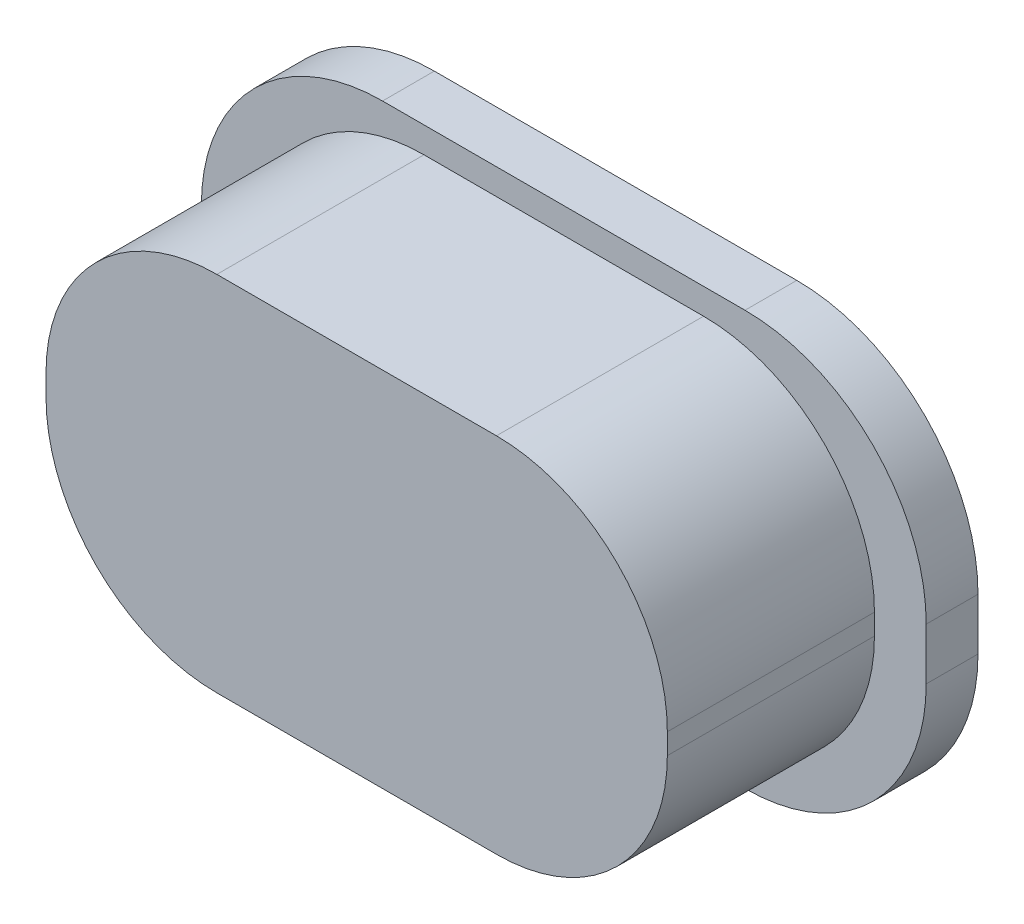
ISO-10303-21;
HEADER;
FILE_DESCRIPTION(('STEP AP214'),'2;1');
FILE_NAME('part.step','',(''),(''),'','','');
FILE_SCHEMA(('AUTOMOTIVE_DESIGN { 1 0 10303 214 1 1 1 1 }'));
ENDSEC;
DATA;
#1=APPLICATION_CONTEXT('core data for automotive mechanical design processes');
#2=APPLICATION_PROTOCOL_DEFINITION('international standard','automotive_design',2000,#1);
#3=PRODUCT_CONTEXT('',#1,'mechanical');
#4=PRODUCT('Part','Part','',(#3));
#5=PRODUCT_RELATED_PRODUCT_CATEGORY('part','',(#4));
#6=PRODUCT_DEFINITION_FORMATION('','',#4);
#7=PRODUCT_DEFINITION_CONTEXT('part definition',#1,'design');
#8=PRODUCT_DEFINITION('design','',#6,#7);
#9=PRODUCT_DEFINITION_SHAPE('','',#8);
#10=(LENGTH_UNIT() NAMED_UNIT(*) SI_UNIT(.MILLI.,.METRE.));
#11=(NAMED_UNIT(*) PLANE_ANGLE_UNIT() SI_UNIT($,.RADIAN.));
#12=(NAMED_UNIT(*) SI_UNIT($,.STERADIAN.) SOLID_ANGLE_UNIT());
#13=UNCERTAINTY_MEASURE_WITH_UNIT(LENGTH_MEASURE(1.E-05),#10,'distance_accuracy_value','');
#14=(GEOMETRIC_REPRESENTATION_CONTEXT(3) GLOBAL_UNCERTAINTY_ASSIGNED_CONTEXT((#13)) GLOBAL_UNIT_ASSIGNED_CONTEXT((#10,
#11,#12)) REPRESENTATION_CONTEXT('',''));
#15=CARTESIAN_POINT('',(0.,0.,0.));
#16=DIRECTION('',(0.,0.,1.));
#17=DIRECTION('',(1.,0.,0.));
#18=AXIS2_PLACEMENT_3D('',#15,#16,#17);
#19=CARTESIAN_POINT('',(0.,0.,1.));
#20=DIRECTION('',(0.,0.,-1.));
#21=DIRECTION('',(-1.,0.,0.));
#22=AXIS2_PLACEMENT_3D('',#19,#20,#21);
#23=PLANE('',#22);
#24=DIRECTION('',(1.,0.,0.));
#25=VECTOR('',#24,1.);
#26=CARTESIAN_POINT('',(-7.,-4.,1.));
#27=LINE('',#26,#25);
#28=CARTESIAN_POINT('',(-3.5,-4.,1.));
#29=VERTEX_POINT('',#28);
#30=CARTESIAN_POINT('',(3.5,-4.,1.));
#31=VERTEX_POINT('',#30);
#32=EDGE_CURVE('E192',#29,#31,#27,.T.);
#33=ORIENTED_EDGE('',*,*,#32,.T.);
#34=CARTESIAN_POINT('',(3.5,-0.500000000000001,1.));
#35=DIRECTION('',(0.,0.,-1.));
#36=DIRECTION('',(-1.,0.,0.));
#37=AXIS2_PLACEMENT_3D('',#34,#35,#36);
#38=CIRCLE('',#37,3.5);
#39=CARTESIAN_POINT('',(7.,-0.500000000000001,1.));
#40=VERTEX_POINT('',#39);
#41=EDGE_CURVE('E255',#31,#40,#38,.F.);
#42=ORIENTED_EDGE('',*,*,#41,.T.);
#43=DIRECTION('',(0.,1.,0.));
#44=VECTOR('',#43,1.);
#45=CARTESIAN_POINT('',(7.,-4.,1.));
#46=LINE('',#45,#44);
#47=CARTESIAN_POINT('',(7.,0.5,1.));
#48=VERTEX_POINT('',#47);
#49=EDGE_CURVE('E184',#40,#48,#46,.T.);
#50=ORIENTED_EDGE('',*,*,#49,.T.);
#51=CARTESIAN_POINT('',(3.5,0.499999999999999,1.));
#52=DIRECTION('',(0.,0.,-1.));
#53=DIRECTION('',(-1.,0.,0.));
#54=AXIS2_PLACEMENT_3D('',#51,#52,#53);
#55=CIRCLE('',#54,3.5);
#56=CARTESIAN_POINT('',(3.5,4.,1.));
#57=VERTEX_POINT('',#56);
#58=EDGE_CURVE('E251',#48,#57,#55,.F.);
#59=ORIENTED_EDGE('',*,*,#58,.T.);
#60=DIRECTION('',(-1.,0.,0.));
#61=VECTOR('',#60,1.);
#62=CARTESIAN_POINT('',(-7.,4.,1.));
#63=LINE('',#62,#61);
#64=CARTESIAN_POINT('',(-3.5,4.,1.));
#65=VERTEX_POINT('',#64);
#66=EDGE_CURVE('E187',#57,#65,#63,.T.);
#67=ORIENTED_EDGE('',*,*,#66,.T.);
#68=CARTESIAN_POINT('',(-3.5,0.5,1.));
#69=DIRECTION('',(0.,0.,-1.));
#70=DIRECTION('',(-1.,0.,0.));
#71=AXIS2_PLACEMENT_3D('',#68,#69,#70);
#72=CIRCLE('',#71,3.5);
#73=CARTESIAN_POINT('',(-7.,0.5,1.));
#74=VERTEX_POINT('',#73);
#75=EDGE_CURVE('E54',#65,#74,#72,.F.);
#76=ORIENTED_EDGE('',*,*,#75,.T.);
#77=DIRECTION('',(0.,-1.,0.));
#78=VECTOR('',#77,1.);
#79=CARTESIAN_POINT('',(-7.,-4.,1.));
#80=LINE('',#79,#78);
#81=CARTESIAN_POINT('',(-7.,-0.500000000000001,1.));
#82=VERTEX_POINT('',#81);
#83=EDGE_CURVE('E190',#74,#82,#80,.T.);
#84=ORIENTED_EDGE('',*,*,#83,.T.);
#85=CARTESIAN_POINT('',(-3.5,-0.500000000000001,1.));
#86=DIRECTION('',(0.,0.,-1.));
#87=DIRECTION('',(-1.,0.,0.));
#88=AXIS2_PLACEMENT_3D('',#85,#86,#87);
#89=CIRCLE('',#88,3.5);
#90=EDGE_CURVE('E253',#82,#29,#89,.F.);
#91=ORIENTED_EDGE('',*,*,#90,.T.);
#92=EDGE_LOOP('',(#33,#42,#50,#59,#67,#76,#84,#91));
#93=FACE_BOUND('',#92,.T.);
#94=DIRECTION('',(0.,1.,0.));
#95=VECTOR('',#94,1.);
#96=CARTESIAN_POINT('',(6.,-3.5,1.));
#97=LINE('',#96,#95);
#98=CARTESIAN_POINT('',(6.,-0.200000000000001,1.));
#99=VERTEX_POINT('',#98);
#100=CARTESIAN_POINT('',(6.,0.2,1.));
#101=VERTEX_POINT('',#100);
#102=EDGE_CURVE('E173',#99,#101,#97,.T.);
#103=ORIENTED_EDGE('',*,*,#102,.F.);
#104=CARTESIAN_POINT('',(2.7,-0.200000000000001,1.));
#105=DIRECTION('',(0.,0.,-1.));
#106=DIRECTION('',(-1.,0.,0.));
#107=AXIS2_PLACEMENT_3D('',#104,#105,#106);
#108=CIRCLE('',#107,3.3);
#109=CARTESIAN_POINT('',(2.7,-3.5,1.));
#110=VERTEX_POINT('',#109);
#111=EDGE_CURVE('E228',#99,#110,#108,.T.);
#112=ORIENTED_EDGE('',*,*,#111,.T.);
#113=DIRECTION('',(1.,0.,0.));
#114=VECTOR('',#113,1.);
#115=CARTESIAN_POINT('',(-6.,-3.5,1.));
#116=LINE('',#115,#114);
#117=CARTESIAN_POINT('',(-2.7,-3.5,1.));
#118=VERTEX_POINT('',#117);
#119=EDGE_CURVE('E176',#118,#110,#116,.T.);
#120=ORIENTED_EDGE('',*,*,#119,.F.);
#121=CARTESIAN_POINT('',(-2.7,-0.200000000000001,1.));
#122=DIRECTION('',(0.,0.,-1.));
#123=DIRECTION('',(-1.,0.,0.));
#124=AXIS2_PLACEMENT_3D('',#121,#122,#123);
#125=CIRCLE('',#124,3.3);
#126=CARTESIAN_POINT('',(-6.,-0.200000000000001,1.));
#127=VERTEX_POINT('',#126);
#128=EDGE_CURVE('E230',#118,#127,#125,.T.);
#129=ORIENTED_EDGE('',*,*,#128,.T.);
#130=DIRECTION('',(0.,-1.,0.));
#131=VECTOR('',#130,1.);
#132=CARTESIAN_POINT('',(-6.,-3.5,1.));
#133=LINE('',#132,#131);
#134=CARTESIAN_POINT('',(-6.,0.2,1.));
#135=VERTEX_POINT('',#134);
#136=EDGE_CURVE('E172',#135,#127,#133,.T.);
#137=ORIENTED_EDGE('',*,*,#136,.F.);
#138=CARTESIAN_POINT('',(-2.7,0.2,1.));
#139=DIRECTION('',(0.,0.,-1.));
#140=DIRECTION('',(-1.,0.,0.));
#141=AXIS2_PLACEMENT_3D('',#138,#139,#140);
#142=CIRCLE('',#141,3.3);
#143=CARTESIAN_POINT('',(-2.7,3.5,1.));
#144=VERTEX_POINT('',#143);
#145=EDGE_CURVE('E157',#135,#144,#142,.T.);
#146=ORIENTED_EDGE('',*,*,#145,.T.);
#147=DIRECTION('',(-1.,0.,0.));
#148=VECTOR('',#147,1.);
#149=CARTESIAN_POINT('',(-6.,3.5,1.));
#150=LINE('',#149,#148);
#151=CARTESIAN_POINT('',(2.7,3.5,1.));
#152=VERTEX_POINT('',#151);
#153=EDGE_CURVE('E164',#152,#144,#150,.T.);
#154=ORIENTED_EDGE('',*,*,#153,.F.);
#155=CARTESIAN_POINT('',(2.7,0.2,1.));
#156=DIRECTION('',(0.,0.,-1.));
#157=DIRECTION('',(-1.,0.,0.));
#158=AXIS2_PLACEMENT_3D('',#155,#156,#157);
#159=CIRCLE('',#158,3.3);
#160=EDGE_CURVE('E147',#152,#101,#159,.T.);
#161=ORIENTED_EDGE('',*,*,#160,.T.);
#162=EDGE_LOOP('',(#103,#112,#120,#129,#137,#146,#154,#161));
#163=FACE_BOUND('',#162,.T.);
#164=ADVANCED_FACE('F32',(#93,#163),#23,.F.);
#165=CARTESIAN_POINT('',(7.,-4.,1.));
#166=DIRECTION('',(-1.,0.,0.));
#167=DIRECTION('',(0.,0.,1.));
#168=AXIS2_PLACEMENT_3D('',#165,#166,#167);
#169=PLANE('',#168);
#170=ORIENTED_EDGE('',*,*,#49,.F.);
#171=DIRECTION('',(0.,0.,-1.));
#172=VECTOR('',#171,1.);
#173=CARTESIAN_POINT('',(7.,-0.500000000000001,1.));
#174=LINE('',#173,#172);
#175=CARTESIAN_POINT('',(7.,-0.500000000000001,0.));
#176=VERTEX_POINT('',#175);
#177=EDGE_CURVE('E234',#40,#176,#174,.T.);
#178=ORIENTED_EDGE('',*,*,#177,.T.);
#179=DIRECTION('',(0.,1.,0.));
#180=VECTOR('',#179,1.);
#181=CARTESIAN_POINT('',(7.,-4.,0.));
#182=LINE('',#181,#180);
#183=CARTESIAN_POINT('',(7.,0.5,0.));
#184=VERTEX_POINT('',#183);
#185=EDGE_CURVE('E195',#176,#184,#182,.T.);
#186=ORIENTED_EDGE('',*,*,#185,.T.);
#187=DIRECTION('',(0.,0.,-1.));
#188=VECTOR('',#187,1.);
#189=CARTESIAN_POINT('',(7.,0.5,1.));
#190=LINE('',#189,#188);
#191=EDGE_CURVE('E232',#184,#48,#190,.F.);
#192=ORIENTED_EDGE('',*,*,#191,.T.);
#193=EDGE_LOOP('',(#170,#178,#186,#192));
#194=FACE_BOUND('',#193,.T.);
#195=ADVANCED_FACE('F289',(#194),#169,.F.);
#196=CARTESIAN_POINT('',(-7.,4.,1.));
#197=DIRECTION('',(0.,-1.,0.));
#198=DIRECTION('',(0.,0.,-1.));
#199=AXIS2_PLACEMENT_3D('',#196,#197,#198);
#200=PLANE('',#199);
#201=ORIENTED_EDGE('',*,*,#66,.F.);
#202=DIRECTION('',(0.,0.,-1.));
#203=VECTOR('',#202,1.);
#204=CARTESIAN_POINT('',(3.5,4.,1.));
#205=LINE('',#204,#203);
#206=CARTESIAN_POINT('',(3.5,4.,0.));
#207=VERTEX_POINT('',#206);
#208=EDGE_CURVE('E11',#57,#207,#205,.T.);
#209=ORIENTED_EDGE('',*,*,#208,.T.);
#210=DIRECTION('',(-1.,0.,0.));
#211=VECTOR('',#210,1.);
#212=CARTESIAN_POINT('',(-7.,4.,0.));
#213=LINE('',#212,#211);
#214=CARTESIAN_POINT('',(-3.5,4.,0.));
#215=VERTEX_POINT('',#214);
#216=EDGE_CURVE('E198',#207,#215,#213,.T.);
#217=ORIENTED_EDGE('',*,*,#216,.T.);
#218=DIRECTION('',(0.,0.,-1.));
#219=VECTOR('',#218,1.);
#220=CARTESIAN_POINT('',(-3.5,4.,1.));
#221=LINE('',#220,#219);
#222=EDGE_CURVE('E40',#215,#65,#221,.F.);
#223=ORIENTED_EDGE('',*,*,#222,.T.);
#224=EDGE_LOOP('',(#201,#209,#217,#223));
#225=FACE_BOUND('',#224,.T.);
#226=ADVANCED_FACE('F263',(#225),#200,.F.);
#227=CARTESIAN_POINT('',(-7.,-4.,1.));
#228=DIRECTION('',(1.,0.,0.));
#229=DIRECTION('',(0.,0.,-1.));
#230=AXIS2_PLACEMENT_3D('',#227,#228,#229);
#231=PLANE('',#230);
#232=DIRECTION('',(0.,-1.,0.));
#233=VECTOR('',#232,1.);
#234=CARTESIAN_POINT('',(-7.,-4.,0.));
#235=LINE('',#234,#233);
#236=CARTESIAN_POINT('',(-7.,0.5,0.));
#237=VERTEX_POINT('',#236);
#238=CARTESIAN_POINT('',(-7.,-0.500000000000001,0.));
#239=VERTEX_POINT('',#238);
#240=EDGE_CURVE('E202',#237,#239,#235,.T.);
#241=ORIENTED_EDGE('',*,*,#240,.T.);
#242=DIRECTION('',(0.,0.,-1.));
#243=VECTOR('',#242,1.);
#244=CARTESIAN_POINT('',(-7.,-0.500000000000001,1.));
#245=LINE('',#244,#243);
#246=EDGE_CURVE('E47',#239,#82,#245,.F.);
#247=ORIENTED_EDGE('',*,*,#246,.T.);
#248=ORIENTED_EDGE('',*,*,#83,.F.);
#249=DIRECTION('',(0.,0.,-1.));
#250=VECTOR('',#249,1.);
#251=CARTESIAN_POINT('',(-7.,0.5,1.));
#252=LINE('',#251,#250);
#253=EDGE_CURVE('E257',#74,#237,#252,.T.);
#254=ORIENTED_EDGE('',*,*,#253,.T.);
#255=EDGE_LOOP('',(#241,#247,#248,#254));
#256=FACE_BOUND('',#255,.T.);
#257=ADVANCED_FACE('F270',(#256),#231,.F.);
#258=CARTESIAN_POINT('',(-7.,-4.,1.));
#259=DIRECTION('',(0.,1.,0.));
#260=DIRECTION('',(0.,0.,1.));
#261=AXIS2_PLACEMENT_3D('',#258,#259,#260);
#262=PLANE('',#261);
#263=DIRECTION('',(1.,0.,0.));
#264=VECTOR('',#263,1.);
#265=CARTESIAN_POINT('',(-7.,-4.,0.));
#266=LINE('',#265,#264);
#267=CARTESIAN_POINT('',(-3.5,-4.,0.));
#268=VERTEX_POINT('',#267);
#269=CARTESIAN_POINT('',(3.5,-4.,0.));
#270=VERTEX_POINT('',#269);
#271=EDGE_CURVE('E188',#268,#270,#266,.T.);
#272=ORIENTED_EDGE('',*,*,#271,.T.);
#273=DIRECTION('',(0.,0.,-1.));
#274=VECTOR('',#273,1.);
#275=CARTESIAN_POINT('',(3.5,-4.,1.));
#276=LINE('',#275,#274);
#277=EDGE_CURVE('E248',#270,#31,#276,.F.);
#278=ORIENTED_EDGE('',*,*,#277,.T.);
#279=ORIENTED_EDGE('',*,*,#32,.F.);
#280=DIRECTION('',(0.,0.,-1.));
#281=VECTOR('',#280,1.);
#282=CARTESIAN_POINT('',(-3.5,-4.,1.));
#283=LINE('',#282,#281);
#284=EDGE_CURVE('E245',#29,#268,#283,.T.);
#285=ORIENTED_EDGE('',*,*,#284,.T.);
#286=EDGE_LOOP('',(#272,#278,#279,#285));
#287=FACE_BOUND('',#286,.T.);
#288=ADVANCED_FACE('F281',(#287),#262,.F.);
#289=CARTESIAN_POINT('',(0.,0.,0.));
#290=DIRECTION('',(0.,0.,-1.));
#291=DIRECTION('',(-1.,0.,0.));
#292=AXIS2_PLACEMENT_3D('',#289,#290,#291);
#293=PLANE('',#292);
#294=ORIENTED_EDGE('',*,*,#185,.F.);
#295=CARTESIAN_POINT('',(3.5,-0.500000000000001,0.));
#296=DIRECTION('',(0.,0.,-1.));
#297=DIRECTION('',(-1.,0.,0.));
#298=AXIS2_PLACEMENT_3D('',#295,#296,#297);
#299=CIRCLE('',#298,3.5);
#300=EDGE_CURVE('E243',#176,#270,#299,.T.);
#301=ORIENTED_EDGE('',*,*,#300,.T.);
#302=ORIENTED_EDGE('',*,*,#271,.F.);
#303=CARTESIAN_POINT('',(-3.5,-0.500000000000001,0.));
#304=DIRECTION('',(0.,0.,-1.));
#305=DIRECTION('',(-1.,0.,0.));
#306=AXIS2_PLACEMENT_3D('',#303,#304,#305);
#307=CIRCLE('',#306,3.5);
#308=EDGE_CURVE('E241',#268,#239,#307,.T.);
#309=ORIENTED_EDGE('',*,*,#308,.T.);
#310=ORIENTED_EDGE('',*,*,#240,.F.);
#311=CARTESIAN_POINT('',(-3.5,0.5,0.));
#312=DIRECTION('',(0.,0.,-1.));
#313=DIRECTION('',(-1.,0.,0.));
#314=AXIS2_PLACEMENT_3D('',#311,#312,#313);
#315=CIRCLE('',#314,3.5);
#316=EDGE_CURVE('E237',#237,#215,#315,.T.);
#317=ORIENTED_EDGE('',*,*,#316,.T.);
#318=ORIENTED_EDGE('',*,*,#216,.F.);
#319=CARTESIAN_POINT('',(3.5,0.499999999999999,0.));
#320=DIRECTION('',(0.,0.,-1.));
#321=DIRECTION('',(-1.,0.,0.));
#322=AXIS2_PLACEMENT_3D('',#319,#320,#321);
#323=CIRCLE('',#322,3.5);
#324=EDGE_CURVE('E239',#207,#184,#323,.T.);
#325=ORIENTED_EDGE('',*,*,#324,.T.);
#326=EDGE_LOOP('',(#294,#301,#302,#309,#310,#317,#318,#325));
#327=FACE_BOUND('',#326,.T.);
#328=ADVANCED_FACE('F273',(#327),#293,.T.);
#329=CARTESIAN_POINT('',(6.,-3.5,5.));
#330=DIRECTION('',(-1.,0.,0.));
#331=DIRECTION('',(0.,0.,1.));
#332=AXIS2_PLACEMENT_3D('',#329,#330,#331);
#333=PLANE('',#332);
#334=ORIENTED_EDGE('',*,*,#102,.T.);
#335=DIRECTION('',(0.,0.,-1.));
#336=VECTOR('',#335,1.);
#337=CARTESIAN_POINT('',(6.,0.2,5.));
#338=LINE('',#337,#336);
#339=CARTESIAN_POINT('',(6.,0.2,5.));
#340=VERTEX_POINT('',#339);
#341=EDGE_CURVE('E152',#101,#340,#338,.F.);
#342=ORIENTED_EDGE('',*,*,#341,.T.);
#343=DIRECTION('',(0.,1.,0.));
#344=VECTOR('',#343,1.);
#345=CARTESIAN_POINT('',(6.,-3.5,5.));
#346=LINE('',#345,#344);
#347=CARTESIAN_POINT('',(6.,-0.200000000000001,5.));
#348=VERTEX_POINT('',#347);
#349=EDGE_CURVE('E183',#348,#340,#346,.T.);
#350=ORIENTED_EDGE('',*,*,#349,.F.);
#351=DIRECTION('',(0.,0.,-1.));
#352=VECTOR('',#351,1.);
#353=CARTESIAN_POINT('',(6.,-0.200000000000001,5.));
#354=LINE('',#353,#352);
#355=EDGE_CURVE('E168',#348,#99,#354,.T.);
#356=ORIENTED_EDGE('',*,*,#355,.T.);
#357=EDGE_LOOP('',(#334,#342,#350,#356));
#358=FACE_BOUND('',#357,.T.);
#359=ADVANCED_FACE('F307',(#358),#333,.F.);
#360=CARTESIAN_POINT('',(-6.,3.5,5.));
#361=DIRECTION('',(0.,-1.,0.));
#362=DIRECTION('',(0.,0.,-1.));
#363=AXIS2_PLACEMENT_3D('',#360,#361,#362);
#364=PLANE('',#363);
#365=DIRECTION('',(-1.,0.,0.));
#366=VECTOR('',#365,1.);
#367=CARTESIAN_POINT('',(-6.,3.5,5.));
#368=LINE('',#367,#366);
#369=CARTESIAN_POINT('',(2.7,3.5,5.));
#370=VERTEX_POINT('',#369);
#371=CARTESIAN_POINT('',(-2.7,3.5,5.));
#372=VERTEX_POINT('',#371);
#373=EDGE_CURVE('E167',#370,#372,#368,.T.);
#374=ORIENTED_EDGE('',*,*,#373,.F.);
#375=DIRECTION('',(0.,0.,-1.));
#376=VECTOR('',#375,1.);
#377=CARTESIAN_POINT('',(2.7,3.5,5.));
#378=LINE('',#377,#376);
#379=EDGE_CURVE('E151',#370,#152,#378,.T.);
#380=ORIENTED_EDGE('',*,*,#379,.T.);
#381=ORIENTED_EDGE('',*,*,#153,.T.);
#382=DIRECTION('',(0.,0.,-1.));
#383=VECTOR('',#382,1.);
#384=CARTESIAN_POINT('',(-2.7,3.5,5.));
#385=LINE('',#384,#383);
#386=EDGE_CURVE('E169',#144,#372,#385,.F.);
#387=ORIENTED_EDGE('',*,*,#386,.T.);
#388=EDGE_LOOP('',(#374,#380,#381,#387));
#389=FACE_BOUND('',#388,.T.);
#390=ADVANCED_FACE('F163',(#389),#364,.F.);
#391=CARTESIAN_POINT('',(-6.,-3.5,5.));
#392=DIRECTION('',(1.,0.,0.));
#393=DIRECTION('',(0.,0.,-1.));
#394=AXIS2_PLACEMENT_3D('',#391,#392,#393);
#395=PLANE('',#394);
#396=DIRECTION('',(0.,-1.,0.));
#397=VECTOR('',#396,1.);
#398=CARTESIAN_POINT('',(-6.,-3.5,5.));
#399=LINE('',#398,#397);
#400=CARTESIAN_POINT('',(-6.,0.2,5.));
#401=VERTEX_POINT('',#400);
#402=CARTESIAN_POINT('',(-6.,-0.200000000000001,5.));
#403=VERTEX_POINT('',#402);
#404=EDGE_CURVE('E467',#401,#403,#399,.T.);
#405=ORIENTED_EDGE('',*,*,#404,.F.);
#406=DIRECTION('',(0.,0.,-1.));
#407=VECTOR('',#406,1.);
#408=CARTESIAN_POINT('',(-6.,0.2,5.));
#409=LINE('',#408,#407);
#410=EDGE_CURVE('E220',#401,#135,#409,.T.);
#411=ORIENTED_EDGE('',*,*,#410,.T.);
#412=ORIENTED_EDGE('',*,*,#136,.T.);
#413=DIRECTION('',(0.,0.,-1.));
#414=VECTOR('',#413,1.);
#415=CARTESIAN_POINT('',(-6.,-0.200000000000001,5.));
#416=LINE('',#415,#414);
#417=EDGE_CURVE('E218',#127,#403,#416,.F.);
#418=ORIENTED_EDGE('',*,*,#417,.T.);
#419=EDGE_LOOP('',(#405,#411,#412,#418));
#420=FACE_BOUND('',#419,.T.);
#421=ADVANCED_FACE('F392',(#420),#395,.F.);
#422=CARTESIAN_POINT('',(-6.,-3.5,5.));
#423=DIRECTION('',(0.,1.,0.));
#424=DIRECTION('',(0.,0.,1.));
#425=AXIS2_PLACEMENT_3D('',#422,#423,#424);
#426=PLANE('',#425);
#427=ORIENTED_EDGE('',*,*,#119,.T.);
#428=DIRECTION('',(0.,0.,-1.));
#429=VECTOR('',#428,1.);
#430=CARTESIAN_POINT('',(2.7,-3.5,5.));
#431=LINE('',#430,#429);
#432=CARTESIAN_POINT('',(2.7,-3.5,5.));
#433=VERTEX_POINT('',#432);
#434=EDGE_CURVE('E158',#110,#433,#431,.F.);
#435=ORIENTED_EDGE('',*,*,#434,.T.);
#436=DIRECTION('',(1.,0.,0.));
#437=VECTOR('',#436,1.);
#438=CARTESIAN_POINT('',(-6.,-3.5,5.));
#439=LINE('',#438,#437);
#440=CARTESIAN_POINT('',(-2.7,-3.5,5.));
#441=VERTEX_POINT('',#440);
#442=EDGE_CURVE('E199',#441,#433,#439,.T.);
#443=ORIENTED_EDGE('',*,*,#442,.F.);
#444=DIRECTION('',(0.,0.,-1.));
#445=VECTOR('',#444,1.);
#446=CARTESIAN_POINT('',(-2.7,-3.5,5.));
#447=LINE('',#446,#445);
#448=EDGE_CURVE('E223',#441,#118,#447,.T.);
#449=ORIENTED_EDGE('',*,*,#448,.T.);
#450=EDGE_LOOP('',(#427,#435,#443,#449));
#451=FACE_BOUND('',#450,.T.);
#452=ADVANCED_FACE('F383',(#451),#426,.F.);
#453=CARTESIAN_POINT('',(0.,0.,5.));
#454=DIRECTION('',(0.,0.,-1.));
#455=DIRECTION('',(-1.,0.,0.));
#456=AXIS2_PLACEMENT_3D('',#453,#454,#455);
#457=PLANE('',#456);
#458=ORIENTED_EDGE('',*,*,#349,.T.);
#459=CARTESIAN_POINT('',(2.7,0.2,5.));
#460=DIRECTION('',(0.,0.,-1.));
#461=DIRECTION('',(-1.,0.,0.));
#462=AXIS2_PLACEMENT_3D('',#459,#460,#461);
#463=CIRCLE('',#462,3.3);
#464=EDGE_CURVE('E216',#340,#370,#463,.F.);
#465=ORIENTED_EDGE('',*,*,#464,.T.);
#466=ORIENTED_EDGE('',*,*,#373,.T.);
#467=CARTESIAN_POINT('',(-2.7,0.2,5.));
#468=DIRECTION('',(0.,0.,-1.));
#469=DIRECTION('',(-1.,0.,0.));
#470=AXIS2_PLACEMENT_3D('',#467,#468,#469);
#471=CIRCLE('',#470,3.3);
#472=EDGE_CURVE('E214',#372,#401,#471,.F.);
#473=ORIENTED_EDGE('',*,*,#472,.T.);
#474=ORIENTED_EDGE('',*,*,#404,.T.);
#475=CARTESIAN_POINT('',(-2.7,-0.200000000000001,5.));
#476=DIRECTION('',(0.,0.,-1.));
#477=DIRECTION('',(-1.,0.,0.));
#478=AXIS2_PLACEMENT_3D('',#475,#476,#477);
#479=CIRCLE('',#478,3.3);
#480=EDGE_CURVE('E210',#403,#441,#479,.F.);
#481=ORIENTED_EDGE('',*,*,#480,.T.);
#482=ORIENTED_EDGE('',*,*,#442,.T.);
#483=CARTESIAN_POINT('',(2.7,-0.200000000000001,5.));
#484=DIRECTION('',(0.,0.,-1.));
#485=DIRECTION('',(-1.,0.,0.));
#486=AXIS2_PLACEMENT_3D('',#483,#484,#485);
#487=CIRCLE('',#486,3.3);
#488=EDGE_CURVE('E212',#433,#348,#487,.F.);
#489=ORIENTED_EDGE('',*,*,#488,.T.);
#490=EDGE_LOOP('',(#458,#465,#466,#473,#474,#481,#482,#489));
#491=FACE_BOUND('',#490,.T.);
#492=ADVANCED_FACE('F320',(#491),#457,.F.);
#493=CARTESIAN_POINT('',(2.7,0.2,5.));
#494=DIRECTION('',(0.,0.,-1.));
#495=DIRECTION('',(-1.,0.,0.));
#496=AXIS2_PLACEMENT_3D('',#493,#494,#495);
#497=CYLINDRICAL_SURFACE('',#496,3.3);
#498=ORIENTED_EDGE('',*,*,#464,.F.);
#499=ORIENTED_EDGE('',*,*,#341,.F.);
#500=ORIENTED_EDGE('',*,*,#160,.F.);
#501=ORIENTED_EDGE('',*,*,#379,.F.);
#502=EDGE_LOOP('',(#498,#499,#500,#501));
#503=FACE_BOUND('',#502,.T.);
#504=ADVANCED_FACE('F150',(#503),#497,.T.);
#505=CARTESIAN_POINT('',(-2.7,0.2,5.));
#506=DIRECTION('',(0.,0.,-1.));
#507=DIRECTION('',(-1.,0.,0.));
#508=AXIS2_PLACEMENT_3D('',#505,#506,#507);
#509=CYLINDRICAL_SURFACE('',#508,3.3);
#510=ORIENTED_EDGE('',*,*,#472,.F.);
#511=ORIENTED_EDGE('',*,*,#386,.F.);
#512=ORIENTED_EDGE('',*,*,#145,.F.);
#513=ORIENTED_EDGE('',*,*,#410,.F.);
#514=EDGE_LOOP('',(#510,#511,#512,#513));
#515=FACE_BOUND('',#514,.T.);
#516=ADVANCED_FACE('F319',(#515),#509,.T.);
#517=CARTESIAN_POINT('',(2.7,-0.200000000000001,5.));
#518=DIRECTION('',(0.,0.,-1.));
#519=DIRECTION('',(-1.,0.,0.));
#520=AXIS2_PLACEMENT_3D('',#517,#518,#519);
#521=CYLINDRICAL_SURFACE('',#520,3.3);
#522=ORIENTED_EDGE('',*,*,#488,.F.);
#523=ORIENTED_EDGE('',*,*,#434,.F.);
#524=ORIENTED_EDGE('',*,*,#111,.F.);
#525=ORIENTED_EDGE('',*,*,#355,.F.);
#526=EDGE_LOOP('',(#522,#523,#524,#525));
#527=FACE_BOUND('',#526,.T.);
#528=ADVANCED_FACE('F323',(#527),#521,.T.);
#529=CARTESIAN_POINT('',(-2.7,-0.200000000000001,5.));
#530=DIRECTION('',(0.,0.,-1.));
#531=DIRECTION('',(-1.,0.,0.));
#532=AXIS2_PLACEMENT_3D('',#529,#530,#531);
#533=CYLINDRICAL_SURFACE('',#532,3.3);
#534=ORIENTED_EDGE('',*,*,#480,.F.);
#535=ORIENTED_EDGE('',*,*,#417,.F.);
#536=ORIENTED_EDGE('',*,*,#128,.F.);
#537=ORIENTED_EDGE('',*,*,#448,.F.);
#538=EDGE_LOOP('',(#534,#535,#536,#537));
#539=FACE_BOUND('',#538,.T.);
#540=ADVANCED_FACE('F327',(#539),#533,.T.);
#541=CARTESIAN_POINT('',(3.5,-0.500000000000001,1.));
#542=DIRECTION('',(0.,0.,-1.));
#543=DIRECTION('',(-1.,0.,0.));
#544=AXIS2_PLACEMENT_3D('',#541,#542,#543);
#545=CYLINDRICAL_SURFACE('',#544,3.5);
#546=ORIENTED_EDGE('',*,*,#41,.F.);
#547=ORIENTED_EDGE('',*,*,#277,.F.);
#548=ORIENTED_EDGE('',*,*,#300,.F.);
#549=ORIENTED_EDGE('',*,*,#177,.F.);
#550=EDGE_LOOP('',(#546,#547,#548,#549));
#551=FACE_BOUND('',#550,.T.);
#552=ADVANCED_FACE('F287',(#551),#545,.T.);
#553=CARTESIAN_POINT('',(-3.5,-0.500000000000001,1.));
#554=DIRECTION('',(0.,0.,-1.));
#555=DIRECTION('',(-1.,0.,0.));
#556=AXIS2_PLACEMENT_3D('',#553,#554,#555);
#557=CYLINDRICAL_SURFACE('',#556,3.5);
#558=ORIENTED_EDGE('',*,*,#90,.F.);
#559=ORIENTED_EDGE('',*,*,#246,.F.);
#560=ORIENTED_EDGE('',*,*,#308,.F.);
#561=ORIENTED_EDGE('',*,*,#284,.F.);
#562=EDGE_LOOP('',(#558,#559,#560,#561));
#563=FACE_BOUND('',#562,.T.);
#564=ADVANCED_FACE('F278',(#563),#557,.T.);
#565=CARTESIAN_POINT('',(3.5,0.499999999999999,1.));
#566=DIRECTION('',(0.,0.,-1.));
#567=DIRECTION('',(-1.,0.,0.));
#568=AXIS2_PLACEMENT_3D('',#565,#566,#567);
#569=CYLINDRICAL_SURFACE('',#568,3.5);
#570=ORIENTED_EDGE('',*,*,#58,.F.);
#571=ORIENTED_EDGE('',*,*,#191,.F.);
#572=ORIENTED_EDGE('',*,*,#324,.F.);
#573=ORIENTED_EDGE('',*,*,#208,.F.);
#574=EDGE_LOOP('',(#570,#571,#572,#573));
#575=FACE_BOUND('',#574,.T.);
#576=ADVANCED_FACE('F292',(#575),#569,.T.);
#577=CARTESIAN_POINT('',(-3.5,0.5,1.));
#578=DIRECTION('',(0.,0.,-1.));
#579=DIRECTION('',(-1.,0.,0.));
#580=AXIS2_PLACEMENT_3D('',#577,#578,#579);
#581=CYLINDRICAL_SURFACE('',#580,3.5);
#582=ORIENTED_EDGE('',*,*,#75,.F.);
#583=ORIENTED_EDGE('',*,*,#222,.F.);
#584=ORIENTED_EDGE('',*,*,#316,.F.);
#585=ORIENTED_EDGE('',*,*,#253,.F.);
#586=EDGE_LOOP('',(#582,#583,#584,#585));
#587=FACE_BOUND('',#586,.T.);
#588=ADVANCED_FACE('F34',(#587),#581,.T.);
#589=CLOSED_SHELL('',(#164,#195,#226,#257,#288,#328,#359,#390,#421,#452,#492,#504,#516,#528,
#540,#552,#564,#576,#588));
#590=MANIFOLD_SOLID_BREP('B2',#589);
#591=ADVANCED_BREP_SHAPE_REPRESENTATION('',(#18,#590),#14);
#592=SHAPE_DEFINITION_REPRESENTATION(#9,#591);
ENDSEC;
END-ISO-10303-21;
